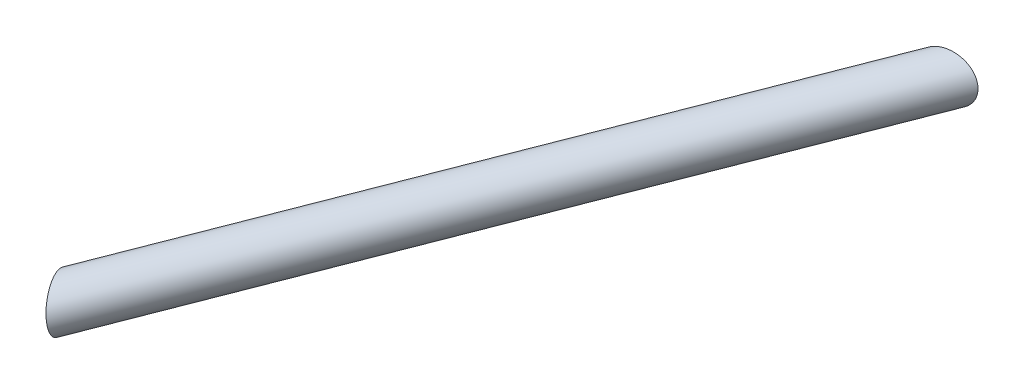
ISO-10303-21;
HEADER;
FILE_DESCRIPTION(('STEP AP214'),'2;1');
FILE_NAME('part.step','',(''),(''),'','','');
FILE_SCHEMA(('AUTOMOTIVE_DESIGN { 1 0 10303 214 1 1 1 1 }'));
ENDSEC;
DATA;
#1=APPLICATION_CONTEXT('core data for automotive mechanical design processes');
#2=APPLICATION_PROTOCOL_DEFINITION('international standard','automotive_design',2000,#1);
#3=PRODUCT_CONTEXT('',#1,'mechanical');
#4=PRODUCT('Part','Part','',(#3));
#5=PRODUCT_RELATED_PRODUCT_CATEGORY('part','',(#4));
#6=PRODUCT_DEFINITION_FORMATION('','',#4);
#7=PRODUCT_DEFINITION_CONTEXT('part definition',#1,'design');
#8=PRODUCT_DEFINITION('design','',#6,#7);
#9=PRODUCT_DEFINITION_SHAPE('','',#8);
#10=(LENGTH_UNIT() NAMED_UNIT(*) SI_UNIT(.MILLI.,.METRE.));
#11=(NAMED_UNIT(*) PLANE_ANGLE_UNIT() SI_UNIT($,.RADIAN.));
#12=(NAMED_UNIT(*) SI_UNIT($,.STERADIAN.) SOLID_ANGLE_UNIT());
#13=UNCERTAINTY_MEASURE_WITH_UNIT(LENGTH_MEASURE(1.E-05),#10,'distance_accuracy_value','');
#14=(GEOMETRIC_REPRESENTATION_CONTEXT(3) GLOBAL_UNCERTAINTY_ASSIGNED_CONTEXT((#13)) GLOBAL_UNIT_ASSIGNED_CONTEXT((#10,
#11,#12)) REPRESENTATION_CONTEXT('',''));
#15=CARTESIAN_POINT('',(0.,0.,0.));
#16=DIRECTION('',(0.,0.,1.));
#17=DIRECTION('',(1.,0.,0.));
#18=AXIS2_PLACEMENT_3D('',#15,#16,#17);
#19=CARTESIAN_POINT('',(50.0000000000001,130.,0.));
#20=DIRECTION('',(0.636784790371593,0.254713916148637,-0.727754046138963));
#21=DIRECTION('',(-0.752576694706878,0.,-0.658504607868518));
#22=AXIS2_PLACEMENT_3D('',#19,#20,#21);
#23=CYLINDRICAL_SURFACE('',#22,7.9);
#24=CARTESIAN_POINT('',(200.,190.,-171.428571428571));
#25=DIRECTION('',(0.,1.,0.));
#26=DIRECTION('',(0.658504607868518,0.,-0.752576694706878));
#27=AXIS2_PLACEMENT_3D('',#24,#25,#26);
#28=ELLIPSE('',#27,31.0151880174069,7.9);
#29=CARTESIAN_POINT('',(210.501750606368,190.,-191.792183638289));
#30=VERTEX_POINT('',#29);
#31=CARTESIAN_POINT('',(208.021674420814,190.,-190.));
#32=VERTEX_POINT('',#31);
#33=EDGE_CURVE('E107',#30,#32,#28,.T.);
#34=ORIENTED_EDGE('',*,*,#33,.T.);
#35=CARTESIAN_POINT('',(216.25,196.5,-190.));
#36=DIRECTION('',(0.,0.,-1.));
#37=DIRECTION('',(0.928476690885259,0.371390676354104,0.));
#38=AXIS2_PLACEMENT_3D('',#35,#36,#37);
#39=ELLIPSE('',#38,10.8553158060924,7.9);
#40=CARTESIAN_POINT('',(225.631031113065,201.793088485731,-190.));
#41=VERTEX_POINT('',#40);
#42=EDGE_CURVE('E96',#32,#41,#39,.T.);
#43=ORIENTED_EDGE('',*,*,#42,.T.);
#44=CARTESIAN_POINT('',(216.296701231053,196.518680492421,-190.053372835489));
#45=DIRECTION('',(0.00725504842418489,-0.00272064315906933,-0.999969980736004));
#46=DIRECTION('',(0.92636602089052,0.376581393205428,0.00569645775229216));
#47=AXIS2_PLACEMENT_3D('',#44,#45,#46);
#48=ELLIPSE('',#47,10.7973779076221,7.9);
#49=CARTESIAN_POINT('',(221.285617721625,190.205319441892,-190.));
#50=VERTEX_POINT('',#49);
#51=EDGE_CURVE('E106',#41,#50,#48,.T.);
#52=ORIENTED_EDGE('',*,*,#51,.T.);
#53=CARTESIAN_POINT('',(220.93155497785,190.,-190.));
#54=VERTEX_POINT('',#53);
#55=EDGE_CURVE('E109',#50,#54,#39,.T.);
#56=ORIENTED_EDGE('',*,*,#55,.T.);
#57=CARTESIAN_POINT('',(220.932059222931,190.,-190.002006543329));
#58=VERTEX_POINT('',#57);
#59=EDGE_CURVE('E59',#54,#58,#28,.T.);
#60=ORIENTED_EDGE('',*,*,#59,.T.);
#61=CARTESIAN_POINT('',(210.067474820191,188.879764778789,-190.077784143776));
#62=VERTEX_POINT('',#61);
#63=EDGE_CURVE('E121',#58,#62,#48,.T.);
#64=ORIENTED_EDGE('',*,*,#63,.T.);
#65=CARTESIAN_POINT('',(212.293529390494,194.917411756198,-185.478319303422));
#66=DIRECTION('',(0.936301069656276,-0.351112901121103,0.00774839511359747));
#67=DIRECTION('',(0.193627409873278,0.497681819611522,-0.845471012261172));
#68=AXIS2_PLACEMENT_3D('',#65,#66,#67);
#69=ELLIPSE('',#68,15.7637429996587,7.9);
#70=EDGE_CURVE('E118',#62,#30,#69,.T.);
#71=ORIENTED_EDGE('',*,*,#70,.T.);
#72=EDGE_LOOP('',(#34,#43,#52,#56,#60,#64,#71));
#73=FACE_BOUND('',#72,.T.);
#74=CARTESIAN_POINT('',(50.,130.,0.));
#75=DIRECTION('',(-0.904650427063292,-0.140780299510552,0.402229427173004));
#76=DIRECTION('',(-0.426154437750217,0.298851652810821,-0.853861865173774));
#77=AXIS2_PLACEMENT_3D('',#74,#75,#76);
#78=ELLIPSE('',#77,8.73265491693323,7.9);
#79=CARTESIAN_POINT('',(46.2785403538077,132.609768355352,-7.45648101529144));
#80=VERTEX_POINT('',#79);
#81=EDGE_CURVE('E45',#80,#80,#78,.T.);
#82=ORIENTED_EDGE('',*,*,#81,.T.);
#83=EDGE_LOOP('',(#82));
#84=FACE_BOUND('',#83,.T.);
#85=ADVANCED_FACE('F41',(#73,#84),#23,.F.);
#86=CARTESIAN_POINT('',(50.0000000000001,130.,0.));
#87=DIRECTION('',(0.636784790371593,0.254713916148637,-0.727754046138963));
#88=DIRECTION('',(-0.752576694706878,0.,-0.658504607868518));
#89=AXIS2_PLACEMENT_3D('',#86,#87,#88);
#90=CYLINDRICAL_SURFACE('',#89,9.5);
#91=CARTESIAN_POINT('',(212.293529390494,194.917411756198,-185.478319303422));
#92=DIRECTION('',(0.936301069656276,-0.351112901121103,0.00774839511359747));
#93=DIRECTION('',(0.193627409873278,0.497681819611522,-0.845471012261172));
#94=AXIS2_PLACEMENT_3D('',#91,#92,#93);
#95=ELLIPSE('',#94,18.9563998097161,9.5);
#96=CARTESIAN_POINT('',(209.403366029717,187.108808004192,-190.077784143776));
#97=VERTEX_POINT('',#96);
#98=CARTESIAN_POINT('',(210.523511327107,190.,-194.42170701778));
#99=VERTEX_POINT('',#98);
#100=EDGE_CURVE('E131',#97,#99,#95,.T.);
#101=ORIENTED_EDGE('',*,*,#100,.F.);
#102=CARTESIAN_POINT('',(216.296701231053,196.518680492421,-190.053372835489));
#103=DIRECTION('',(0.00725504842418489,-0.00272064315906933,-0.999969980736004));
#104=DIRECTION('',(0.92636602089052,0.376581393205428,0.00569645775229216));
#105=AXIS2_PLACEMENT_3D('',#102,#103,#104);
#106=ELLIPSE('',#105,12.9841886230899,9.5);
#107=CARTESIAN_POINT('',(226.472431202689,204.036822058062,-190.));
#108=VERTEX_POINT('',#107);
#109=EDGE_CURVE('E130',#108,#97,#106,.T.);
#110=ORIENTED_EDGE('',*,*,#109,.F.);
#111=CARTESIAN_POINT('',(216.25,196.5,-190.));
#112=DIRECTION('',(0.,0.,-1.));
#113=DIRECTION('',(0.928476690885259,0.371390676354104,0.));
#114=AXIS2_PLACEMENT_3D('',#111,#112,#113);
#115=ELLIPSE('',#114,13.0538607794782,9.5);
#116=CARTESIAN_POINT('',(205.069430309634,190.,-190.));
#117=VERTEX_POINT('',#116);
#118=EDGE_CURVE('E127',#117,#108,#115,.T.);
#119=ORIENTED_EDGE('',*,*,#118,.F.);
#120=CARTESIAN_POINT('',(200.,190.,-171.428571428571));
#121=DIRECTION('',(0.,1.,0.));
#122=DIRECTION('',(0.658504607868518,0.,-0.752576694706878));
#123=AXIS2_PLACEMENT_3D('',#120,#121,#122);
#124=ELLIPSE('',#123,37.2967450842235,9.5);
#125=EDGE_CURVE('E112',#99,#117,#124,.T.);
#126=ORIENTED_EDGE('',*,*,#125,.F.);
#127=EDGE_LOOP('',(#101,#110,#119,#126));
#128=FACE_BOUND('',#127,.T.);
#129=CARTESIAN_POINT('',(50.,130.,0.));
#130=DIRECTION('',(-0.904650427063292,-0.140780299510552,0.402229427173004));
#131=DIRECTION('',(-0.426154437750217,0.298851652810821,-0.853861865173774));
#132=AXIS2_PLACEMENT_3D('',#129,#130,#131);
#133=ELLIPSE('',#132,10.5012938874513,9.5);
#134=CARTESIAN_POINT('',(45.5248270077434,133.138329034917,-8.96665438547707));
#135=VERTEX_POINT('',#134);
#136=EDGE_CURVE('E11',#135,#135,#133,.T.);
#137=ORIENTED_EDGE('',*,*,#136,.F.);
#138=EDGE_LOOP('',(#137));
#139=FACE_BOUND('',#138,.T.);
#140=ADVANCED_FACE('F150',(#128,#139),#90,.T.);
#141=CARTESIAN_POINT('',(215.709539787679,203.48392257962,-210.077183758496));
#142=DIRECTION('',(0.936301069656276,-0.351112901121103,0.00774839511359747));
#143=DIRECTION('',(0.351123441588392,0.936329177569045,0.));
#144=AXIS2_PLACEMENT_3D('',#141,#142,#143);
#145=PLANE('',#144);
#146=DIRECTION('',(-0.351123441588392,-0.936329177569044,0.));
#147=VECTOR('',#146,1.);
#148=CARTESIAN_POINT('',(215.564438819195,203.538335442802,-190.077784143776));
#149=LINE('',#148,#147);
#150=EDGE_CURVE('E132',#62,#97,#149,.T.);
#151=ORIENTED_EDGE('',*,*,#150,.T.);
#152=ORIENTED_EDGE('',*,*,#100,.T.);
#153=DIRECTION('',(0.00827525467579686,0.,-0.999965759493819));
#154=VECTOR('',#153,1.);
#155=CARTESIAN_POINT('',(210.457097247969,190.,-186.396358229372));
#156=LINE('',#155,#154);
#157=EDGE_CURVE('E89',#30,#99,#156,.T.);
#158=ORIENTED_EDGE('',*,*,#157,.F.);
#159=ORIENTED_EDGE('',*,*,#70,.F.);
#160=EDGE_LOOP('',(#151,#152,#158,#159));
#161=FACE_BOUND('',#160,.T.);
#162=ADVANCED_FACE('F153',(#161),#145,.T.);
#163=CARTESIAN_POINT('',(234.290460212321,196.51607742038,-189.922816241504));
#164=DIRECTION('',(0.00725504842418489,-0.00272064315906933,-0.999969980736004));
#165=DIRECTION('',(-0.999973681595049,0.,-0.00725507527490251));
#166=AXIS2_PLACEMENT_3D('',#163,#164,#165);
#167=PLANE('',#166);
#168=DIRECTION('',(-0.999973681595049,0.,-0.00725507527490251));
#169=VECTOR('',#168,1.);
#170=CARTESIAN_POINT('',(-224.976513310608,190.,-193.237191947704));
#171=LINE('',#170,#169);
#172=CARTESIAN_POINT('',(221.208622930916,190.,-190.));
#173=VERTEX_POINT('',#172);
#174=EDGE_CURVE('E51',#173,#58,#171,.T.);
#175=ORIENTED_EDGE('',*,*,#174,.F.);
#176=DIRECTION('',(-0.351123441588392,-0.936329177569045,0.));
#177=VECTOR('',#176,1.);
#178=CARTESIAN_POINT('',(166.196600925734,43.3012746528497,-190.));
#179=LINE('',#178,#177);
#180=EDGE_CURVE('E129',#50,#173,#179,.T.);
#181=ORIENTED_EDGE('',*,*,#180,.F.);
#182=ORIENTED_EDGE('',*,*,#51,.F.);
#183=EDGE_CURVE('E102',#108,#41,#179,.T.);
#184=ORIENTED_EDGE('',*,*,#183,.F.);
#185=ORIENTED_EDGE('',*,*,#109,.T.);
#186=ORIENTED_EDGE('',*,*,#150,.F.);
#187=ORIENTED_EDGE('',*,*,#63,.F.);
#188=EDGE_LOOP('',(#175,#181,#182,#184,#185,#186,#187));
#189=FACE_BOUND('',#188,.T.);
#190=ADVANCED_FACE('F147',(#189),#167,.T.);
#191=CARTESIAN_POINT('',(-225.,190.,-190.));
#192=DIRECTION('',(0.,0.,-1.));
#193=DIRECTION('',(-1.,0.,0.));
#194=AXIS2_PLACEMENT_3D('',#191,#192,#193);
#195=PLANE('',#194);
#196=ORIENTED_EDGE('',*,*,#180,.T.);
#197=DIRECTION('',(1.,0.,0.));
#198=VECTOR('',#197,1.);
#199=CARTESIAN_POINT('',(-225.,190.,-190.));
#200=LINE('',#199,#198);
#201=EDGE_CURVE('E113',#54,#173,#200,.T.);
#202=ORIENTED_EDGE('',*,*,#201,.F.);
#203=ORIENTED_EDGE('',*,*,#55,.F.);
#204=EDGE_LOOP('',(#196,#202,#203));
#205=FACE_BOUND('',#204,.T.);
#206=ADVANCED_FACE('F171',(#205),#195,.T.);
#207=EDGE_CURVE('E99',#117,#32,#200,.T.);
#208=ORIENTED_EDGE('',*,*,#207,.F.);
#209=ORIENTED_EDGE('',*,*,#118,.T.);
#210=ORIENTED_EDGE('',*,*,#183,.T.);
#211=ORIENTED_EDGE('',*,*,#42,.F.);
#212=EDGE_LOOP('',(#208,#209,#210,#211));
#213=FACE_BOUND('',#212,.T.);
#214=ADVANCED_FACE('F98',(#213),#195,.T.);
#215=CARTESIAN_POINT('',(-225.,190.,-190.));
#216=DIRECTION('',(0.,1.,0.));
#217=DIRECTION('',(0.,0.,1.));
#218=AXIS2_PLACEMENT_3D('',#215,#216,#217);
#219=PLANE('',#218);
#220=ORIENTED_EDGE('',*,*,#157,.T.);
#221=ORIENTED_EDGE('',*,*,#125,.T.);
#222=ORIENTED_EDGE('',*,*,#207,.T.);
#223=ORIENTED_EDGE('',*,*,#33,.F.);
#224=EDGE_LOOP('',(#220,#221,#222,#223));
#225=FACE_BOUND('',#224,.T.);
#226=ADVANCED_FACE('F110',(#225),#219,.T.);
#227=ORIENTED_EDGE('',*,*,#201,.T.);
#228=ORIENTED_EDGE('',*,*,#174,.T.);
#229=ORIENTED_EDGE('',*,*,#59,.F.);
#230=EDGE_LOOP('',(#227,#228,#229));
#231=FACE_BOUND('',#230,.T.);
#232=ADVANCED_FACE('F144',(#231),#219,.T.);
#233=CARTESIAN_POINT('',(50.,130.,0.));
#234=DIRECTION('',(-0.904650427063292,-0.140780299510552,0.402229427173004));
#235=DIRECTION('',(0.406275581998161,0.,0.913750595880547));
#236=AXIS2_PLACEMENT_3D('',#233,#234,#235);
#237=PLANE('',#236);
#238=ORIENTED_EDGE('',*,*,#81,.F.);
#239=EDGE_LOOP('',(#238));
#240=FACE_BOUND('',#239,.T.);
#241=ORIENTED_EDGE('',*,*,#136,.T.);
#242=EDGE_LOOP('',(#241));
#243=FACE_BOUND('',#242,.T.);
#244=ADVANCED_FACE('F43',(#240,#243),#237,.T.);
#245=CLOSED_SHELL('',(#85,#140,#162,#190,#206,#214,#226,#232,#244));
#246=MANIFOLD_SOLID_BREP('B2',#245);
#247=ADVANCED_BREP_SHAPE_REPRESENTATION('',(#18,#246),#14);
#248=SHAPE_DEFINITION_REPRESENTATION(#9,#247);
ENDSEC;
END-ISO-10303-21;
